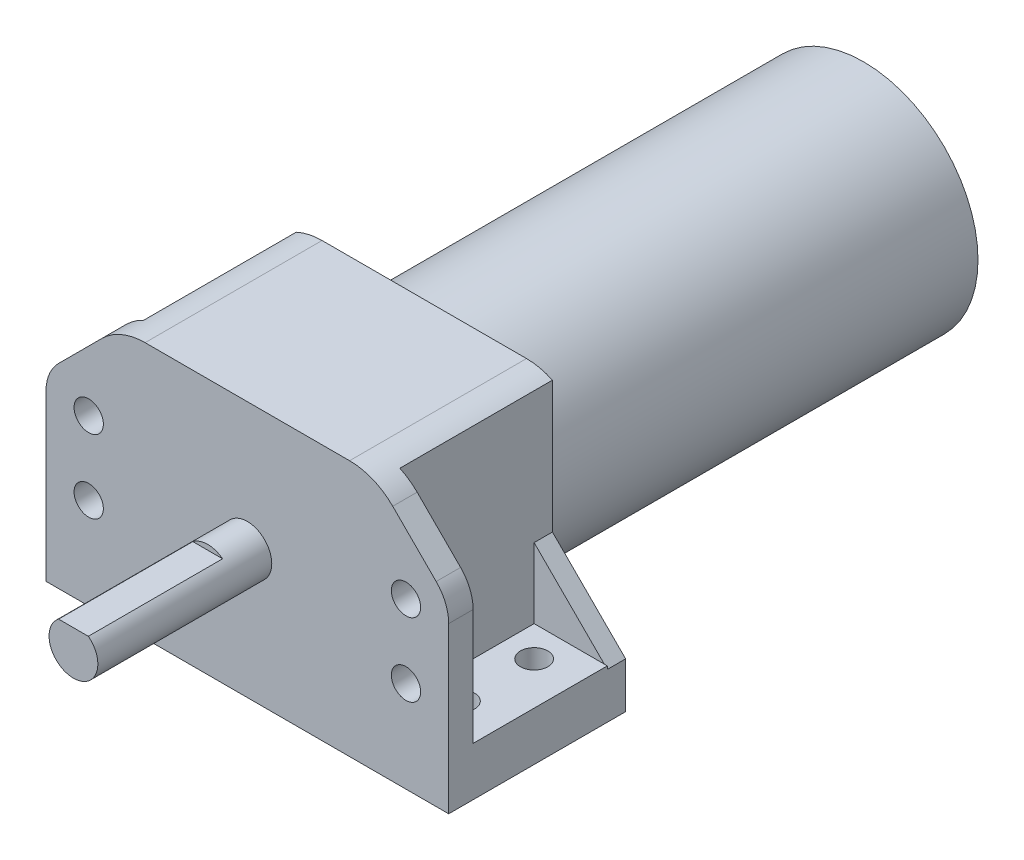
ISO-10303-21;
HEADER;
FILE_DESCRIPTION(('STEP AP214'),'2;1');
FILE_NAME('part.step','',(''),(''),'','','');
FILE_SCHEMA(('AUTOMOTIVE_DESIGN { 1 0 10303 214 1 1 1 1 }'));
ENDSEC;
DATA;
#1=APPLICATION_CONTEXT('core data for automotive mechanical design processes');
#2=APPLICATION_PROTOCOL_DEFINITION('international standard','automotive_design',2000,#1);
#3=PRODUCT_CONTEXT('',#1,'mechanical');
#4=PRODUCT('Part','Part','',(#3));
#5=PRODUCT_RELATED_PRODUCT_CATEGORY('part','',(#4));
#6=PRODUCT_DEFINITION_FORMATION('','',#4);
#7=PRODUCT_DEFINITION_CONTEXT('part definition',#1,'design');
#8=PRODUCT_DEFINITION('design','',#6,#7);
#9=PRODUCT_DEFINITION_SHAPE('','',#8);
#10=(LENGTH_UNIT() NAMED_UNIT(*) SI_UNIT(.MILLI.,.METRE.));
#11=(NAMED_UNIT(*) PLANE_ANGLE_UNIT() SI_UNIT($,.RADIAN.));
#12=(NAMED_UNIT(*) SI_UNIT($,.STERADIAN.) SOLID_ANGLE_UNIT());
#13=UNCERTAINTY_MEASURE_WITH_UNIT(LENGTH_MEASURE(1.E-05),#10,'distance_accuracy_value','');
#14=(GEOMETRIC_REPRESENTATION_CONTEXT(3) GLOBAL_UNCERTAINTY_ASSIGNED_CONTEXT((#13)) GLOBAL_UNIT_ASSIGNED_CONTEXT((#10,
#11,#12)) REPRESENTATION_CONTEXT('',''));
#15=CARTESIAN_POINT('',(0.,0.,0.));
#16=DIRECTION('',(0.,0.,1.));
#17=DIRECTION('',(1.,0.,0.));
#18=AXIS2_PLACEMENT_3D('',#15,#16,#17);
#19=CARTESIAN_POINT('',(-33.,21.,72.));
#20=DIRECTION('',(-1.,0.,0.));
#21=DIRECTION('',(0.,0.,1.));
#22=AXIS2_PLACEMENT_3D('',#19,#20,#21);
#23=PLANE('',#22);
#24=DIRECTION('',(0.,0.,-1.));
#25=VECTOR('',#24,1.);
#26=CARTESIAN_POINT('',(-33.,-13.5000000000001,91.9705627484772));
#27=LINE('',#26,#25);
#28=CARTESIAN_POINT('',(-33.,-13.5000000000001,75.));
#29=VERTEX_POINT('',#28);
#30=CARTESIAN_POINT('',(-33.,-13.5000000000001,72.));
#31=VERTEX_POINT('',#30);
#32=EDGE_CURVE('E354',#29,#31,#27,.T.);
#33=ORIENTED_EDGE('',*,*,#32,.T.);
#34=DIRECTION('',(0.,-1.,0.));
#35=VECTOR('',#34,1.);
#36=CARTESIAN_POINT('',(-33.,21.,72.));
#37=LINE('',#36,#35);
#38=CARTESIAN_POINT('',(-33.,-21.,72.));
#39=VERTEX_POINT('',#38);
#40=EDGE_CURVE('E233',#31,#39,#37,.T.);
#41=ORIENTED_EDGE('',*,*,#40,.T.);
#42=DIRECTION('',(0.,0.,1.));
#43=VECTOR('',#42,1.);
#44=CARTESIAN_POINT('',(-33.,-21.,72.));
#45=LINE('',#44,#43);
#46=CARTESIAN_POINT('',(-33.,-21.,101.));
#47=VERTEX_POINT('',#46);
#48=EDGE_CURVE('E231',#39,#47,#45,.T.);
#49=ORIENTED_EDGE('',*,*,#48,.T.);
#50=DIRECTION('',(0.,-1.,0.));
#51=VECTOR('',#50,1.);
#52=CARTESIAN_POINT('',(-33.,21.,101.));
#53=LINE('',#52,#51);
#54=CARTESIAN_POINT('',(-33.,6.,101.));
#55=VERTEX_POINT('',#54);
#56=EDGE_CURVE('E237',#55,#47,#53,.T.);
#57=ORIENTED_EDGE('',*,*,#56,.F.);
#58=DIRECTION('',(0.,0.,1.));
#59=VECTOR('',#58,1.);
#60=CARTESIAN_POINT('',(-33.,6.,0.));
#61=LINE('',#60,#59);
#62=CARTESIAN_POINT('',(-33.,6.,97.));
#63=VERTEX_POINT('',#62);
#64=EDGE_CURVE('E334',#63,#55,#61,.T.);
#65=ORIENTED_EDGE('',*,*,#64,.F.);
#66=DIRECTION('',(0.,-1.,0.));
#67=VECTOR('',#66,1.);
#68=CARTESIAN_POINT('',(-33.,21.,97.));
#69=LINE('',#68,#67);
#70=CARTESIAN_POINT('',(-33.,-13.,97.));
#71=VERTEX_POINT('',#70);
#72=EDGE_CURVE('E363',#63,#71,#69,.T.);
#73=ORIENTED_EDGE('',*,*,#72,.T.);
#74=DIRECTION('',(0.,0.,-1.));
#75=VECTOR('',#74,1.);
#76=CARTESIAN_POINT('',(-33.,-13.,97.));
#77=LINE('',#76,#75);
#78=CARTESIAN_POINT('',(-33.,-13.,75.));
#79=VERTEX_POINT('',#78);
#80=EDGE_CURVE('E467',#71,#79,#77,.T.);
#81=ORIENTED_EDGE('',*,*,#80,.T.);
#82=DIRECTION('',(0.,-1.,0.));
#83=VECTOR('',#82,1.);
#84=CARTESIAN_POINT('',(-33.,-13.5000000000001,75.));
#85=LINE('',#84,#83);
#86=EDGE_CURVE('E448',#79,#29,#85,.T.);
#87=ORIENTED_EDGE('',*,*,#86,.T.);
#88=EDGE_LOOP('',(#33,#41,#49,#57,#65,#73,#81,#87));
#89=FACE_BOUND('',#88,.T.);
#90=ADVANCED_FACE('F47',(#89),#23,.T.);
#91=CARTESIAN_POINT('',(0.,0.,72.));
#92=DIRECTION('',(0.,0.,-1.));
#93=DIRECTION('',(-1.,0.,0.));
#94=AXIS2_PLACEMENT_3D('',#91,#92,#93);
#95=PLANE('',#94);
#96=DIRECTION('',(-0.707106781186544,0.707106781186551,0.));
#97=VECTOR('',#96,1.);
#98=CARTESIAN_POINT('',(21.,-1.5,72.));
#99=LINE('',#98,#97);
#100=CARTESIAN_POINT('',(33.,-13.5000000000001,72.));
#101=VERTEX_POINT('',#100);
#102=CARTESIAN_POINT('',(21.,-1.5,72.));
#103=VERTEX_POINT('',#102);
#104=EDGE_CURVE('E205',#101,#103,#99,.T.);
#105=ORIENTED_EDGE('',*,*,#104,.F.);
#106=DIRECTION('',(0.,1.,0.));
#107=VECTOR('',#106,1.);
#108=CARTESIAN_POINT('',(33.,21.,72.));
#109=LINE('',#108,#107);
#110=CARTESIAN_POINT('',(33.,-21.,72.));
#111=VERTEX_POINT('',#110);
#112=EDGE_CURVE('E219',#111,#101,#109,.T.);
#113=ORIENTED_EDGE('',*,*,#112,.F.);
#114=DIRECTION('',(1.,0.,0.));
#115=VECTOR('',#114,1.);
#116=CARTESIAN_POINT('',(33.,-21.,72.));
#117=LINE('',#116,#115);
#118=EDGE_CURVE('E228',#39,#111,#117,.T.);
#119=ORIENTED_EDGE('',*,*,#118,.F.);
#120=ORIENTED_EDGE('',*,*,#40,.F.);
#121=DIRECTION('',(-0.707106781186544,-0.707106781186551,0.));
#122=VECTOR('',#121,1.);
#123=CARTESIAN_POINT('',(-21.,-1.5,72.));
#124=LINE('',#123,#122);
#125=CARTESIAN_POINT('',(-21.,-1.5,72.));
#126=VERTEX_POINT('',#125);
#127=EDGE_CURVE('E222',#126,#31,#124,.T.);
#128=ORIENTED_EDGE('',*,*,#127,.F.);
#129=DIRECTION('',(0.,1.,0.));
#130=VECTOR('',#129,1.);
#131=CARTESIAN_POINT('',(-21.,-1.5,72.));
#132=LINE('',#131,#130);
#133=CARTESIAN_POINT('',(-21.,20.0553851381374,72.));
#134=VERTEX_POINT('',#133);
#135=EDGE_CURVE('E469',#126,#134,#132,.T.);
#136=ORIENTED_EDGE('',*,*,#135,.T.);
#137=CARTESIAN_POINT('',(-16.7573593128807,11.,72.));
#138=DIRECTION('',(0.,0.,-1.));
#139=DIRECTION('',(-1.,0.,0.));
#140=AXIS2_PLACEMENT_3D('',#137,#138,#139);
#141=CIRCLE('',#140,10.);
#142=CARTESIAN_POINT('',(-16.7573593128807,21.,72.));
#143=VERTEX_POINT('',#142);
#144=EDGE_CURVE('E299',#134,#143,#141,.T.);
#145=ORIENTED_EDGE('',*,*,#144,.T.);
#146=DIRECTION('',(-1.,0.,0.));
#147=VECTOR('',#146,1.);
#148=CARTESIAN_POINT('',(33.,21.,72.));
#149=LINE('',#148,#147);
#150=CARTESIAN_POINT('',(16.7573593128807,21.,72.));
#151=VERTEX_POINT('',#150);
#152=EDGE_CURVE('E227',#151,#143,#149,.T.);
#153=ORIENTED_EDGE('',*,*,#152,.F.);
#154=CARTESIAN_POINT('',(16.7573593128807,11.,72.));
#155=DIRECTION('',(0.,0.,-1.));
#156=DIRECTION('',(-1.,0.,0.));
#157=AXIS2_PLACEMENT_3D('',#154,#155,#156);
#158=CIRCLE('',#157,10.);
#159=CARTESIAN_POINT('',(21.,20.0553851381374,72.));
#160=VERTEX_POINT('',#159);
#161=EDGE_CURVE('E297',#151,#160,#158,.T.);
#162=ORIENTED_EDGE('',*,*,#161,.T.);
#163=DIRECTION('',(0.,1.,0.));
#164=VECTOR('',#163,1.);
#165=CARTESIAN_POINT('',(21.,-1.5,72.));
#166=LINE('',#165,#164);
#167=EDGE_CURVE('E221',#103,#160,#166,.T.);
#168=ORIENTED_EDGE('',*,*,#167,.F.);
#169=EDGE_LOOP('',(#105,#113,#119,#120,#128,#136,#145,#153,#162,#168));
#170=FACE_BOUND('',#169,.T.);
#171=CARTESIAN_POINT('',(0.,0.,72.));
#172=DIRECTION('',(0.,0.,-1.));
#173=DIRECTION('',(-1.,0.,0.));
#174=AXIS2_PLACEMENT_3D('',#171,#172,#173);
#175=CIRCLE('',#174,18.75);
#176=CARTESIAN_POINT('',(-18.75,0.,72.));
#177=VERTEX_POINT('',#176);
#178=EDGE_CURVE('E250',#177,#177,#175,.T.);
#179=ORIENTED_EDGE('',*,*,#178,.F.);
#180=EDGE_LOOP('',(#179));
#181=FACE_BOUND('',#180,.T.);
#182=ADVANCED_FACE('F216',(#170,#181),#95,.T.);
#183=CARTESIAN_POINT('',(-26.,6.,0.));
#184=DIRECTION('',(0.,0.,1.));
#185=DIRECTION('',(1.,0.,0.));
#186=AXIS2_PLACEMENT_3D('',#183,#184,#185);
#187=CYLINDRICAL_SURFACE('',#186,2.4);
#188=CARTESIAN_POINT('',(-26.,6.,101.));
#189=DIRECTION('',(0.,0.,1.));
#190=DIRECTION('',(1.,0.,0.));
#191=AXIS2_PLACEMENT_3D('',#188,#189,#190);
#192=CIRCLE('',#191,2.4);
#193=CARTESIAN_POINT('',(-23.6,6.,101.));
#194=VERTEX_POINT('',#193);
#195=EDGE_CURVE('E240',#194,#194,#192,.T.);
#196=ORIENTED_EDGE('',*,*,#195,.T.);
#197=EDGE_LOOP('',(#196));
#198=FACE_BOUND('',#197,.T.);
#199=CARTESIAN_POINT('',(-26.,6.,97.));
#200=DIRECTION('',(0.,0.,-1.));
#201=DIRECTION('',(-1.,0.,0.));
#202=AXIS2_PLACEMENT_3D('',#199,#200,#201);
#203=CIRCLE('',#202,2.4);
#204=CARTESIAN_POINT('',(-28.4,6.,97.));
#205=VERTEX_POINT('',#204);
#206=EDGE_CURVE('E373',#205,#205,#203,.F.);
#207=ORIENTED_EDGE('',*,*,#206,.F.);
#208=EDGE_LOOP('',(#207));
#209=FACE_BOUND('',#208,.T.);
#210=ADVANCED_FACE('F535',(#198,#209),#187,.F.);
#211=CARTESIAN_POINT('',(-30.9497474683058,10.9497474683058,0.));
#212=DIRECTION('',(0.707106781186546,-0.707106781186549,0.));
#213=DIRECTION('',(0.707106781186549,0.707106781186546,0.));
#214=AXIS2_PLACEMENT_3D('',#211,#212,#213);
#215=PLANE('',#214);
#216=DIRECTION('',(0.707106781186549,0.707106781186546,0.));
#217=VECTOR('',#216,1.);
#218=CARTESIAN_POINT('',(-30.9497474683058,10.9497474683058,101.));
#219=LINE('',#218,#217);
#220=CARTESIAN_POINT('',(-30.9497474683058,10.9497474683058,101.));
#221=VERTEX_POINT('',#220);
#222=CARTESIAN_POINT('',(-23.8284271247461,18.0710678118655,101.));
#223=VERTEX_POINT('',#222);
#224=EDGE_CURVE('E336',#221,#223,#219,.T.);
#225=ORIENTED_EDGE('',*,*,#224,.T.);
#226=DIRECTION('',(0.,0.,1.));
#227=VECTOR('',#226,1.);
#228=CARTESIAN_POINT('',(-23.8284271247461,18.0710678118655,72.));
#229=LINE('',#228,#227);
#230=CARTESIAN_POINT('',(-23.8284271247461,18.0710678118655,97.));
#231=VERTEX_POINT('',#230);
#232=EDGE_CURVE('E291',#223,#231,#229,.F.);
#233=ORIENTED_EDGE('',*,*,#232,.T.);
#234=DIRECTION('',(0.707106781186549,0.707106781186546,0.));
#235=VECTOR('',#234,1.);
#236=CARTESIAN_POINT('',(-30.9497474683058,10.9497474683058,97.));
#237=LINE('',#236,#235);
#238=CARTESIAN_POINT('',(-30.9497474683058,10.9497474683058,97.));
#239=VERTEX_POINT('',#238);
#240=EDGE_CURVE('E371',#239,#231,#237,.T.);
#241=ORIENTED_EDGE('',*,*,#240,.F.);
#242=DIRECTION('',(0.,0.,1.));
#243=VECTOR('',#242,1.);
#244=CARTESIAN_POINT('',(-30.9497474683058,10.9497474683058,0.));
#245=LINE('',#244,#243);
#246=EDGE_CURVE('E337',#239,#221,#245,.T.);
#247=ORIENTED_EDGE('',*,*,#246,.T.);
#248=EDGE_LOOP('',(#225,#233,#241,#247));
#249=FACE_BOUND('',#248,.T.);
#250=ADVANCED_FACE('F513',(#249),#215,.F.);
#251=CARTESIAN_POINT('',(-26.,6.,0.));
#252=DIRECTION('',(0.,0.,1.));
#253=DIRECTION('',(1.,0.,0.));
#254=AXIS2_PLACEMENT_3D('',#251,#252,#253);
#255=CYLINDRICAL_SURFACE('',#254,6.99999999999999);
#256=CARTESIAN_POINT('',(-26.,6.,97.));
#257=DIRECTION('',(0.,0.,-1.));
#258=DIRECTION('',(-1.,0.,0.));
#259=AXIS2_PLACEMENT_3D('',#256,#257,#258);
#260=CIRCLE('',#259,6.99999999999999);
#261=EDGE_CURVE('E282',#63,#239,#260,.T.);
#262=ORIENTED_EDGE('',*,*,#261,.F.);
#263=ORIENTED_EDGE('',*,*,#64,.T.);
#264=CARTESIAN_POINT('',(-26.,6.,101.));
#265=DIRECTION('',(0.,0.,-1.));
#266=DIRECTION('',(-1.,0.,0.));
#267=AXIS2_PLACEMENT_3D('',#264,#265,#266);
#268=CIRCLE('',#267,6.99999999999999);
#269=EDGE_CURVE('E333',#55,#221,#268,.T.);
#270=ORIENTED_EDGE('',*,*,#269,.T.);
#271=ORIENTED_EDGE('',*,*,#246,.F.);
#272=EDGE_LOOP('',(#262,#263,#270,#271));
#273=FACE_BOUND('',#272,.T.);
#274=ADVANCED_FACE('F366',(#273),#255,.T.);
#275=CARTESIAN_POINT('',(-26.,-6.,0.));
#276=DIRECTION('',(0.,0.,1.));
#277=DIRECTION('',(1.,0.,0.));
#278=AXIS2_PLACEMENT_3D('',#275,#276,#277);
#279=CYLINDRICAL_SURFACE('',#278,2.4);
#280=CARTESIAN_POINT('',(-26.,-6.,101.));
#281=DIRECTION('',(0.,0.,1.));
#282=DIRECTION('',(1.,0.,0.));
#283=AXIS2_PLACEMENT_3D('',#280,#281,#282);
#284=CIRCLE('',#283,2.4);
#285=CARTESIAN_POINT('',(-23.6,-6.,101.));
#286=VERTEX_POINT('',#285);
#287=EDGE_CURVE('E330',#286,#286,#284,.T.);
#288=ORIENTED_EDGE('',*,*,#287,.T.);
#289=EDGE_LOOP('',(#288));
#290=FACE_BOUND('',#289,.T.);
#291=CARTESIAN_POINT('',(-26.,-6.,97.));
#292=DIRECTION('',(0.,0.,-1.));
#293=DIRECTION('',(-1.,0.,0.));
#294=AXIS2_PLACEMENT_3D('',#291,#292,#293);
#295=CIRCLE('',#294,2.4);
#296=CARTESIAN_POINT('',(-28.4,-6.,97.));
#297=VERTEX_POINT('',#296);
#298=EDGE_CURVE('E279',#297,#297,#295,.F.);
#299=ORIENTED_EDGE('',*,*,#298,.F.);
#300=EDGE_LOOP('',(#299));
#301=FACE_BOUND('',#300,.T.);
#302=ADVANCED_FACE('F599',(#290,#301),#279,.F.);
#303=CARTESIAN_POINT('',(-26.,21.,92.));
#304=DIRECTION('',(0.,-1.,0.));
#305=DIRECTION('',(1.,0.,0.));
#306=AXIS2_PLACEMENT_3D('',#303,#304,#305);
#307=CYLINDRICAL_SURFACE('',#306,2.25);
#308=CARTESIAN_POINT('',(-26.,-21.,92.));
#309=DIRECTION('',(0.,-1.,0.));
#310=DIRECTION('',(1.,0.,0.));
#311=AXIS2_PLACEMENT_3D('',#308,#309,#310);
#312=CIRCLE('',#311,2.25);
#313=CARTESIAN_POINT('',(-23.75,-21.,92.));
#314=VERTEX_POINT('',#313);
#315=EDGE_CURVE('E413',#314,#314,#312,.T.);
#316=ORIENTED_EDGE('',*,*,#315,.T.);
#317=EDGE_LOOP('',(#316));
#318=FACE_BOUND('',#317,.T.);
#319=CARTESIAN_POINT('',(-26.,-13.,92.));
#320=DIRECTION('',(0.,1.,0.));
#321=DIRECTION('',(0.,0.,1.));
#322=AXIS2_PLACEMENT_3D('',#319,#320,#321);
#323=CIRCLE('',#322,2.25);
#324=CARTESIAN_POINT('',(-26.,-13.,94.25));
#325=VERTEX_POINT('',#324);
#326=EDGE_CURVE('E277',#325,#325,#323,.F.);
#327=ORIENTED_EDGE('',*,*,#326,.F.);
#328=EDGE_LOOP('',(#327));
#329=FACE_BOUND('',#328,.T.);
#330=ADVANCED_FACE('F587',(#318,#329),#307,.F.);
#331=CARTESIAN_POINT('',(-26.,21.,80.));
#332=DIRECTION('',(0.,-1.,0.));
#333=DIRECTION('',(1.,0.,0.));
#334=AXIS2_PLACEMENT_3D('',#331,#332,#333);
#335=CYLINDRICAL_SURFACE('',#334,2.25);
#336=CARTESIAN_POINT('',(-26.,-21.,80.));
#337=DIRECTION('',(0.,-1.,0.));
#338=DIRECTION('',(1.,0.,0.));
#339=AXIS2_PLACEMENT_3D('',#336,#337,#338);
#340=CIRCLE('',#339,2.25);
#341=CARTESIAN_POINT('',(-23.75,-21.,80.));
#342=VERTEX_POINT('',#341);
#343=EDGE_CURVE('E410',#342,#342,#340,.T.);
#344=ORIENTED_EDGE('',*,*,#343,.T.);
#345=EDGE_LOOP('',(#344));
#346=FACE_BOUND('',#345,.T.);
#347=CARTESIAN_POINT('',(-26.,-13.,80.));
#348=DIRECTION('',(0.,1.,0.));
#349=DIRECTION('',(0.,0.,1.));
#350=AXIS2_PLACEMENT_3D('',#347,#348,#349);
#351=CIRCLE('',#350,2.25);
#352=CARTESIAN_POINT('',(-26.,-13.,82.25));
#353=VERTEX_POINT('',#352);
#354=EDGE_CURVE('E274',#353,#353,#351,.F.);
#355=ORIENTED_EDGE('',*,*,#354,.F.);
#356=EDGE_LOOP('',(#355));
#357=FACE_BOUND('',#356,.T.);
#358=ADVANCED_FACE('F547',(#346,#357),#335,.F.);
#359=CARTESIAN_POINT('',(0.,0.,101.));
#360=DIRECTION('',(0.,0.,1.));
#361=DIRECTION('',(1.,0.,0.));
#362=AXIS2_PLACEMENT_3D('',#359,#360,#361);
#363=PLANE('',#362);
#364=ORIENTED_EDGE('',*,*,#287,.F.);
#365=EDGE_LOOP('',(#364));
#366=FACE_BOUND('',#365,.T.);
#367=DIRECTION('',(-1.,0.,0.));
#368=VECTOR('',#367,1.);
#369=CARTESIAN_POINT('',(33.,21.,101.));
#370=LINE('',#369,#368);
#371=CARTESIAN_POINT('',(16.7573593128807,21.,101.));
#372=VERTEX_POINT('',#371);
#373=CARTESIAN_POINT('',(-16.7573593128807,21.,101.));
#374=VERTEX_POINT('',#373);
#375=EDGE_CURVE('E246',#372,#374,#370,.T.);
#376=ORIENTED_EDGE('',*,*,#375,.T.);
#377=CARTESIAN_POINT('',(-16.7573593128807,11.,101.));
#378=DIRECTION('',(0.,0.,1.));
#379=DIRECTION('',(1.,0.,0.));
#380=AXIS2_PLACEMENT_3D('',#377,#378,#379);
#381=CIRCLE('',#380,10.);
#382=EDGE_CURVE('E289',#374,#223,#381,.T.);
#383=ORIENTED_EDGE('',*,*,#382,.T.);
#384=ORIENTED_EDGE('',*,*,#224,.F.);
#385=ORIENTED_EDGE('',*,*,#269,.F.);
#386=ORIENTED_EDGE('',*,*,#56,.T.);
#387=DIRECTION('',(1.,0.,0.));
#388=VECTOR('',#387,1.);
#389=CARTESIAN_POINT('',(33.,-21.,101.));
#390=LINE('',#389,#388);
#391=CARTESIAN_POINT('',(33.,-21.,101.));
#392=VERTEX_POINT('',#391);
#393=EDGE_CURVE('E239',#47,#392,#390,.T.);
#394=ORIENTED_EDGE('',*,*,#393,.T.);
#395=DIRECTION('',(0.,1.,0.));
#396=VECTOR('',#395,1.);
#397=CARTESIAN_POINT('',(33.,21.,101.));
#398=LINE('',#397,#396);
#399=CARTESIAN_POINT('',(33.,5.99999999999998,101.));
#400=VERTEX_POINT('',#399);
#401=EDGE_CURVE('E243',#392,#400,#398,.T.);
#402=ORIENTED_EDGE('',*,*,#401,.T.);
#403=CARTESIAN_POINT('',(26.,5.99999999999998,101.));
#404=DIRECTION('',(0.,0.,-1.));
#405=DIRECTION('',(1.,0.,0.));
#406=AXIS2_PLACEMENT_3D('',#403,#404,#405);
#407=CIRCLE('',#406,6.99999999999999);
#408=CARTESIAN_POINT('',(30.9497474683058,10.9497474683058,101.));
#409=VERTEX_POINT('',#408);
#410=EDGE_CURVE('E320',#409,#400,#407,.T.);
#411=ORIENTED_EDGE('',*,*,#410,.F.);
#412=DIRECTION('',(0.707106781186548,-0.707106781186547,0.));
#413=VECTOR('',#412,1.);
#414=CARTESIAN_POINT('',(30.9497474683058,10.9497474683058,101.));
#415=LINE('',#414,#413);
#416=CARTESIAN_POINT('',(23.8284271247461,18.0710678118655,101.));
#417=VERTEX_POINT('',#416);
#418=EDGE_CURVE('E309',#417,#409,#415,.T.);
#419=ORIENTED_EDGE('',*,*,#418,.F.);
#420=CARTESIAN_POINT('',(16.7573593128807,11.,101.));
#421=DIRECTION('',(0.,0.,1.));
#422=DIRECTION('',(1.,0.,0.));
#423=AXIS2_PLACEMENT_3D('',#420,#421,#422);
#424=CIRCLE('',#423,10.);
#425=EDGE_CURVE('E287',#417,#372,#424,.T.);
#426=ORIENTED_EDGE('',*,*,#425,.T.);
#427=EDGE_LOOP('',(#376,#383,#384,#385,#386,#394,#402,#411,#419,#426));
#428=FACE_BOUND('',#427,.T.);
#429=CARTESIAN_POINT('',(26.,-6.00000000000002,101.));
#430=DIRECTION('',(0.,0.,1.));
#431=DIRECTION('',(-1.,0.,0.));
#432=AXIS2_PLACEMENT_3D('',#429,#430,#431);
#433=CIRCLE('',#432,2.4);
#434=CARTESIAN_POINT('',(23.6,-6.00000000000002,101.));
#435=VERTEX_POINT('',#434);
#436=EDGE_CURVE('E324',#435,#435,#433,.T.);
#437=ORIENTED_EDGE('',*,*,#436,.F.);
#438=EDGE_LOOP('',(#437));
#439=FACE_BOUND('',#438,.T.);
#440=CARTESIAN_POINT('',(26.,5.99999999999998,101.));
#441=DIRECTION('',(0.,0.,1.));
#442=DIRECTION('',(-1.,0.,0.));
#443=AXIS2_PLACEMENT_3D('',#440,#441,#442);
#444=CIRCLE('',#443,2.4);
#445=CARTESIAN_POINT('',(23.6,5.99999999999998,101.));
#446=VERTEX_POINT('',#445);
#447=EDGE_CURVE('E321',#446,#446,#444,.T.);
#448=ORIENTED_EDGE('',*,*,#447,.F.);
#449=EDGE_LOOP('',(#448));
#450=FACE_BOUND('',#449,.T.);
#451=ORIENTED_EDGE('',*,*,#195,.F.);
#452=EDGE_LOOP('',(#451));
#453=FACE_BOUND('',#452,.T.);
#454=CARTESIAN_POINT('',(0.,0.,101.));
#455=DIRECTION('',(0.,0.,1.));
#456=DIRECTION('',(1.,0.,0.));
#457=AXIS2_PLACEMENT_3D('',#454,#455,#456);
#458=CIRCLE('',#457,4.);
#459=CARTESIAN_POINT('',(4.,0.,101.));
#460=VERTEX_POINT('',#459);
#461=EDGE_CURVE('E253',#460,#460,#458,.T.);
#462=ORIENTED_EDGE('',*,*,#461,.F.);
#463=EDGE_LOOP('',(#462));
#464=FACE_BOUND('',#463,.T.);
#465=ADVANCED_FACE('F316',(#366,#428,#439,#450,#453,#464),#363,.T.);
#466=CARTESIAN_POINT('',(0.,0.,101.));
#467=DIRECTION('',(0.,0.,1.));
#468=DIRECTION('',(1.,0.,0.));
#469=AXIS2_PLACEMENT_3D('',#466,#467,#468);
#470=CYLINDRICAL_SURFACE('',#469,4.);
#471=DIRECTION('',(0.,0.,1.));
#472=VECTOR('',#471,1.);
#473=CARTESIAN_POINT('',(2.43948765112677,3.17,107.5));
#474=LINE('',#473,#472);
#475=CARTESIAN_POINT('',(2.43948765112677,3.17,107.5));
#476=VERTEX_POINT('',#475);
#477=CARTESIAN_POINT('',(2.43948765112677,3.17,129.5));
#478=VERTEX_POINT('',#477);
#479=EDGE_CURVE('E464',#476,#478,#474,.T.);
#480=ORIENTED_EDGE('',*,*,#479,.T.);
#481=CARTESIAN_POINT('',(0.,0.,129.5));
#482=DIRECTION('',(0.,0.,1.));
#483=DIRECTION('',(1.,0.,0.));
#484=AXIS2_PLACEMENT_3D('',#481,#482,#483);
#485=CIRCLE('',#484,4.);
#486=CARTESIAN_POINT('',(-2.43948765112677,3.17,129.5));
#487=VERTEX_POINT('',#486);
#488=EDGE_CURVE('E257',#487,#478,#485,.T.);
#489=ORIENTED_EDGE('',*,*,#488,.F.);
#490=DIRECTION('',(0.,0.,1.));
#491=VECTOR('',#490,1.);
#492=CARTESIAN_POINT('',(-2.43948765112677,3.17,107.5));
#493=LINE('',#492,#491);
#494=CARTESIAN_POINT('',(-2.43948765112677,3.17,107.5));
#495=VERTEX_POINT('',#494);
#496=EDGE_CURVE('E62',#495,#487,#493,.T.);
#497=ORIENTED_EDGE('',*,*,#496,.F.);
#498=CARTESIAN_POINT('',(0.,0.,107.5));
#499=DIRECTION('',(0.,0.,1.));
#500=DIRECTION('',(1.,0.,0.));
#501=AXIS2_PLACEMENT_3D('',#498,#499,#500);
#502=CIRCLE('',#501,4.);
#503=EDGE_CURVE('E458',#476,#495,#502,.T.);
#504=ORIENTED_EDGE('',*,*,#503,.F.);
#505=EDGE_LOOP('',(#480,#489,#497,#504));
#506=FACE_BOUND('',#505,.T.);
#507=ORIENTED_EDGE('',*,*,#461,.T.);
#508=EDGE_LOOP('',(#507));
#509=FACE_BOUND('',#508,.T.);
#510=ADVANCED_FACE('F540',(#506,#509),#470,.T.);
#511=CARTESIAN_POINT('',(0.,0.,129.5));
#512=DIRECTION('',(0.,0.,1.));
#513=DIRECTION('',(1.,0.,0.));
#514=AXIS2_PLACEMENT_3D('',#511,#512,#513);
#515=PLANE('',#514);
#516=DIRECTION('',(1.,0.,0.));
#517=VECTOR('',#516,1.);
#518=CARTESIAN_POINT('',(-2.43948765112677,3.17,129.5));
#519=LINE('',#518,#517);
#520=EDGE_CURVE('E457',#487,#478,#519,.T.);
#521=ORIENTED_EDGE('',*,*,#520,.F.);
#522=ORIENTED_EDGE('',*,*,#488,.T.);
#523=EDGE_LOOP('',(#521,#522));
#524=FACE_BOUND('',#523,.T.);
#525=ADVANCED_FACE('F543',(#524),#515,.T.);
#526=CARTESIAN_POINT('',(33.,21.,72.));
#527=DIRECTION('',(0.,1.,0.));
#528=DIRECTION('',(-1.,0.,0.));
#529=AXIS2_PLACEMENT_3D('',#526,#527,#528);
#530=PLANE('',#529);
#531=ORIENTED_EDGE('',*,*,#152,.T.);
#532=DIRECTION('',(0.,0.,1.));
#533=VECTOR('',#532,1.);
#534=CARTESIAN_POINT('',(-16.7573593128807,21.,101.));
#535=LINE('',#534,#533);
#536=EDGE_CURVE('E284',#143,#374,#535,.T.);
#537=ORIENTED_EDGE('',*,*,#536,.T.);
#538=ORIENTED_EDGE('',*,*,#375,.F.);
#539=DIRECTION('',(0.,0.,1.));
#540=VECTOR('',#539,1.);
#541=CARTESIAN_POINT('',(16.7573593128807,21.,72.));
#542=LINE('',#541,#540);
#543=EDGE_CURVE('E262',#372,#151,#542,.F.);
#544=ORIENTED_EDGE('',*,*,#543,.T.);
#545=EDGE_LOOP('',(#531,#537,#538,#544));
#546=FACE_BOUND('',#545,.T.);
#547=ADVANCED_FACE('F511',(#546),#530,.T.);
#548=CARTESIAN_POINT('',(33.,21.,72.));
#549=DIRECTION('',(1.,0.,0.));
#550=DIRECTION('',(0.,0.,-1.));
#551=AXIS2_PLACEMENT_3D('',#548,#549,#550);
#552=PLANE('',#551);
#553=DIRECTION('',(0.,0.,-1.));
#554=VECTOR('',#553,1.);
#555=CARTESIAN_POINT('',(33.,-13.5000000000001,91.9705627484772));
#556=LINE('',#555,#554);
#557=CARTESIAN_POINT('',(33.,-13.5000000000001,75.));
#558=VERTEX_POINT('',#557);
#559=EDGE_CURVE('E201',#558,#101,#556,.T.);
#560=ORIENTED_EDGE('',*,*,#559,.F.);
#561=DIRECTION('',(0.,1.,0.));
#562=VECTOR('',#561,1.);
#563=CARTESIAN_POINT('',(33.,-13.5000000000001,75.));
#564=LINE('',#563,#562);
#565=CARTESIAN_POINT('',(33.,-13.,75.));
#566=VERTEX_POINT('',#565);
#567=EDGE_CURVE('E440',#558,#566,#564,.T.);
#568=ORIENTED_EDGE('',*,*,#567,.T.);
#569=DIRECTION('',(0.,0.,-1.));
#570=VECTOR('',#569,1.);
#571=CARTESIAN_POINT('',(33.,-13.,97.));
#572=LINE('',#571,#570);
#573=CARTESIAN_POINT('',(33.,-13.,97.));
#574=VERTEX_POINT('',#573);
#575=EDGE_CURVE('E384',#574,#566,#572,.T.);
#576=ORIENTED_EDGE('',*,*,#575,.F.);
#577=DIRECTION('',(0.,-1.,0.));
#578=VECTOR('',#577,1.);
#579=CARTESIAN_POINT('',(33.,21.,97.));
#580=LINE('',#579,#578);
#581=CARTESIAN_POINT('',(33.,5.99999999999998,97.));
#582=VERTEX_POINT('',#581);
#583=EDGE_CURVE('E380',#582,#574,#580,.T.);
#584=ORIENTED_EDGE('',*,*,#583,.F.);
#585=DIRECTION('',(0.,0.,1.));
#586=VECTOR('',#585,1.);
#587=CARTESIAN_POINT('',(33.,5.99999999999998,0.));
#588=LINE('',#587,#586);
#589=EDGE_CURVE('E421',#582,#400,#588,.T.);
#590=ORIENTED_EDGE('',*,*,#589,.T.);
#591=ORIENTED_EDGE('',*,*,#401,.F.);
#592=DIRECTION('',(0.,0.,1.));
#593=VECTOR('',#592,1.);
#594=CARTESIAN_POINT('',(33.,-21.,72.));
#595=LINE('',#594,#593);
#596=EDGE_CURVE('E226',#111,#392,#595,.T.);
#597=ORIENTED_EDGE('',*,*,#596,.F.);
#598=ORIENTED_EDGE('',*,*,#112,.T.);
#599=EDGE_LOOP('',(#560,#568,#576,#584,#590,#591,#597,#598));
#600=FACE_BOUND('',#599,.T.);
#601=ADVANCED_FACE('F224',(#600),#552,.T.);
#602=CARTESIAN_POINT('',(33.,-21.,72.));
#603=DIRECTION('',(0.,-1.,0.));
#604=DIRECTION('',(1.,0.,0.));
#605=AXIS2_PLACEMENT_3D('',#602,#603,#604);
#606=PLANE('',#605);
#607=CARTESIAN_POINT('',(26.,-21.,92.));
#608=DIRECTION('',(0.,-1.,0.));
#609=DIRECTION('',(-1.,0.,0.));
#610=AXIS2_PLACEMENT_3D('',#607,#608,#609);
#611=CIRCLE('',#610,2.25);
#612=CARTESIAN_POINT('',(23.75,-21.,92.));
#613=VERTEX_POINT('',#612);
#614=EDGE_CURVE('E409',#613,#613,#611,.T.);
#615=ORIENTED_EDGE('',*,*,#614,.F.);
#616=EDGE_LOOP('',(#615));
#617=FACE_BOUND('',#616,.T.);
#618=CARTESIAN_POINT('',(26.,-21.,80.));
#619=DIRECTION('',(0.,-1.,0.));
#620=DIRECTION('',(-1.,0.,0.));
#621=AXIS2_PLACEMENT_3D('',#618,#619,#620);
#622=CIRCLE('',#621,2.25);
#623=CARTESIAN_POINT('',(23.75,-21.,80.));
#624=VERTEX_POINT('',#623);
#625=EDGE_CURVE('E414',#624,#624,#622,.T.);
#626=ORIENTED_EDGE('',*,*,#625,.F.);
#627=EDGE_LOOP('',(#626));
#628=FACE_BOUND('',#627,.T.);
#629=ORIENTED_EDGE('',*,*,#343,.F.);
#630=EDGE_LOOP('',(#629));
#631=FACE_BOUND('',#630,.T.);
#632=ORIENTED_EDGE('',*,*,#315,.F.);
#633=EDGE_LOOP('',(#632));
#634=FACE_BOUND('',#633,.T.);
#635=ORIENTED_EDGE('',*,*,#393,.F.);
#636=ORIENTED_EDGE('',*,*,#48,.F.);
#637=ORIENTED_EDGE('',*,*,#118,.T.);
#638=ORIENTED_EDGE('',*,*,#596,.T.);
#639=EDGE_LOOP('',(#635,#636,#637,#638));
#640=FACE_BOUND('',#639,.T.);
#641=ADVANCED_FACE('F357',(#617,#628,#631,#634,#640),#606,.T.);
#642=CARTESIAN_POINT('',(0.,0.,0.));
#643=DIRECTION('',(0.,0.,1.));
#644=DIRECTION('',(1.,0.,0.));
#645=AXIS2_PLACEMENT_3D('',#642,#643,#644);
#646=PLANE('',#645);
#647=CARTESIAN_POINT('',(0.,0.,0.));
#648=DIRECTION('',(0.,0.,1.));
#649=DIRECTION('',(1.,0.,0.));
#650=AXIS2_PLACEMENT_3D('',#647,#648,#649);
#651=CIRCLE('',#650,18.75);
#652=CARTESIAN_POINT('',(18.75,0.,0.));
#653=VERTEX_POINT('',#652);
#654=EDGE_CURVE('E256',#653,#653,#651,.T.);
#655=ORIENTED_EDGE('',*,*,#654,.F.);
#656=EDGE_LOOP('',(#655));
#657=FACE_BOUND('',#656,.T.);
#658=ADVANCED_FACE('F552',(#657),#646,.F.);
#659=CARTESIAN_POINT('',(0.,0.,129.5));
#660=DIRECTION('',(0.,0.,-1.));
#661=DIRECTION('',(-1.,0.,0.));
#662=AXIS2_PLACEMENT_3D('',#659,#660,#661);
#663=CYLINDRICAL_SURFACE('',#662,18.75);
#664=ORIENTED_EDGE('',*,*,#178,.T.);
#665=EDGE_LOOP('',(#664));
#666=FACE_BOUND('',#665,.T.);
#667=ORIENTED_EDGE('',*,*,#654,.T.);
#668=EDGE_LOOP('',(#667));
#669=FACE_BOUND('',#668,.T.);
#670=ADVANCED_FACE('F555',(#666,#669),#663,.T.);
#671=CARTESIAN_POINT('',(26.,5.99999999999998,0.));
#672=DIRECTION('',(0.,0.,1.));
#673=DIRECTION('',(1.,0.,0.));
#674=AXIS2_PLACEMENT_3D('',#671,#672,#673);
#675=CYLINDRICAL_SURFACE('',#674,6.99999999999999);
#676=ORIENTED_EDGE('',*,*,#589,.F.);
#677=CARTESIAN_POINT('',(26.,5.99999999999998,97.));
#678=DIRECTION('',(0.,0.,1.));
#679=DIRECTION('',(1.,0.,0.));
#680=AXIS2_PLACEMENT_3D('',#677,#678,#679);
#681=CIRCLE('',#680,6.99999999999999);
#682=CARTESIAN_POINT('',(30.9497474683058,10.9497474683058,97.));
#683=VERTEX_POINT('',#682);
#684=EDGE_CURVE('E406',#582,#683,#681,.T.);
#685=ORIENTED_EDGE('',*,*,#684,.T.);
#686=DIRECTION('',(0.,0.,1.));
#687=VECTOR('',#686,1.);
#688=CARTESIAN_POINT('',(30.9497474683058,10.9497474683058,0.));
#689=LINE('',#688,#687);
#690=EDGE_CURVE('E326',#683,#409,#689,.T.);
#691=ORIENTED_EDGE('',*,*,#690,.T.);
#692=ORIENTED_EDGE('',*,*,#410,.T.);
#693=EDGE_LOOP('',(#676,#685,#691,#692));
#694=FACE_BOUND('',#693,.T.);
#695=ADVANCED_FACE('F426',(#694),#675,.T.);
#696=CARTESIAN_POINT('',(30.9497474683058,10.9497474683058,0.));
#697=DIRECTION('',(-0.707106781186547,-0.707106781186548,0.));
#698=DIRECTION('',(0.707106781186548,-0.707106781186547,0.));
#699=AXIS2_PLACEMENT_3D('',#696,#697,#698);
#700=PLANE('',#699);
#701=DIRECTION('',(-0.707106781186548,0.707106781186547,0.));
#702=VECTOR('',#701,1.);
#703=CARTESIAN_POINT('',(30.9497474683058,10.9497474683058,97.));
#704=LINE('',#703,#702);
#705=CARTESIAN_POINT('',(23.8284271247461,18.0710678118655,97.));
#706=VERTEX_POINT('',#705);
#707=EDGE_CURVE('E311',#683,#706,#704,.T.);
#708=ORIENTED_EDGE('',*,*,#707,.T.);
#709=DIRECTION('',(0.,0.,1.));
#710=VECTOR('',#709,1.);
#711=CARTESIAN_POINT('',(23.8284271247461,18.0710678118655,101.));
#712=LINE('',#711,#710);
#713=EDGE_CURVE('E301',#706,#417,#712,.T.);
#714=ORIENTED_EDGE('',*,*,#713,.T.);
#715=ORIENTED_EDGE('',*,*,#418,.T.);
#716=ORIENTED_EDGE('',*,*,#690,.F.);
#717=EDGE_LOOP('',(#708,#714,#715,#716));
#718=FACE_BOUND('',#717,.T.);
#719=ADVANCED_FACE('F307',(#718),#700,.F.);
#720=CARTESIAN_POINT('',(26.,5.99999999999998,0.));
#721=DIRECTION('',(0.,0.,1.));
#722=DIRECTION('',(1.,0.,0.));
#723=AXIS2_PLACEMENT_3D('',#720,#721,#722);
#724=CYLINDRICAL_SURFACE('',#723,2.4);
#725=CARTESIAN_POINT('',(26.,5.99999999999998,97.));
#726=DIRECTION('',(0.,0.,1.));
#727=DIRECTION('',(1.,0.,0.));
#728=AXIS2_PLACEMENT_3D('',#725,#726,#727);
#729=CIRCLE('',#728,2.4);
#730=CARTESIAN_POINT('',(28.4,5.99999999999998,97.));
#731=VERTEX_POINT('',#730);
#732=EDGE_CURVE('E273',#731,#731,#729,.F.);
#733=ORIENTED_EDGE('',*,*,#732,.T.);
#734=EDGE_LOOP('',(#733));
#735=FACE_BOUND('',#734,.T.);
#736=ORIENTED_EDGE('',*,*,#447,.T.);
#737=EDGE_LOOP('',(#736));
#738=FACE_BOUND('',#737,.T.);
#739=ADVANCED_FACE('F603',(#735,#738),#724,.F.);
#740=CARTESIAN_POINT('',(26.,-6.00000000000002,0.));
#741=DIRECTION('',(0.,0.,1.));
#742=DIRECTION('',(1.,0.,0.));
#743=AXIS2_PLACEMENT_3D('',#740,#741,#742);
#744=CYLINDRICAL_SURFACE('',#743,2.4);
#745=CARTESIAN_POINT('',(26.,-6.00000000000002,97.));
#746=DIRECTION('',(0.,0.,1.));
#747=DIRECTION('',(1.,0.,0.));
#748=AXIS2_PLACEMENT_3D('',#745,#746,#747);
#749=CIRCLE('',#748,2.4);
#750=CARTESIAN_POINT('',(28.4,-6.00000000000002,97.));
#751=VERTEX_POINT('',#750);
#752=EDGE_CURVE('E270',#751,#751,#749,.F.);
#753=ORIENTED_EDGE('',*,*,#752,.T.);
#754=EDGE_LOOP('',(#753));
#755=FACE_BOUND('',#754,.T.);
#756=ORIENTED_EDGE('',*,*,#436,.T.);
#757=EDGE_LOOP('',(#756));
#758=FACE_BOUND('',#757,.T.);
#759=ADVANCED_FACE('F592',(#755,#758),#744,.F.);
#760=CARTESIAN_POINT('',(26.,21.,80.));
#761=DIRECTION('',(0.,-1.,0.));
#762=DIRECTION('',(1.,0.,0.));
#763=AXIS2_PLACEMENT_3D('',#760,#761,#762);
#764=CYLINDRICAL_SURFACE('',#763,2.25);
#765=CARTESIAN_POINT('',(26.,-13.,80.));
#766=DIRECTION('',(0.,-1.,0.));
#767=DIRECTION('',(0.,0.,-1.));
#768=AXIS2_PLACEMENT_3D('',#765,#766,#767);
#769=CIRCLE('',#768,2.25);
#770=CARTESIAN_POINT('',(26.,-13.,77.75));
#771=VERTEX_POINT('',#770);
#772=EDGE_CURVE('E268',#771,#771,#769,.F.);
#773=ORIENTED_EDGE('',*,*,#772,.T.);
#774=EDGE_LOOP('',(#773));
#775=FACE_BOUND('',#774,.T.);
#776=ORIENTED_EDGE('',*,*,#625,.T.);
#777=EDGE_LOOP('',(#776));
#778=FACE_BOUND('',#777,.T.);
#779=ADVANCED_FACE('F589',(#775,#778),#764,.F.);
#780=CARTESIAN_POINT('',(26.,21.,92.));
#781=DIRECTION('',(0.,-1.,0.));
#782=DIRECTION('',(1.,0.,0.));
#783=AXIS2_PLACEMENT_3D('',#780,#781,#782);
#784=CYLINDRICAL_SURFACE('',#783,2.25);
#785=CARTESIAN_POINT('',(26.,-13.,92.));
#786=DIRECTION('',(0.,-1.,0.));
#787=DIRECTION('',(0.,0.,-1.));
#788=AXIS2_PLACEMENT_3D('',#785,#786,#787);
#789=CIRCLE('',#788,2.25);
#790=CARTESIAN_POINT('',(26.,-13.,89.75));
#791=VERTEX_POINT('',#790);
#792=EDGE_CURVE('E265',#791,#791,#789,.F.);
#793=ORIENTED_EDGE('',*,*,#792,.T.);
#794=EDGE_LOOP('',(#793));
#795=FACE_BOUND('',#794,.T.);
#796=ORIENTED_EDGE('',*,*,#614,.T.);
#797=EDGE_LOOP('',(#796));
#798=FACE_BOUND('',#797,.T.);
#799=ADVANCED_FACE('F575',(#795,#798),#784,.F.);
#800=CARTESIAN_POINT('',(21.,0.,0.));
#801=DIRECTION('',(1.,0.,0.));
#802=DIRECTION('',(0.,0.,-1.));
#803=AXIS2_PLACEMENT_3D('',#800,#801,#802);
#804=PLANE('',#803);
#805=ORIENTED_EDGE('',*,*,#167,.T.);
#806=DIRECTION('',(0.,0.,-1.));
#807=VECTOR('',#806,1.);
#808=CARTESIAN_POINT('',(21.,20.0553851381374,72.));
#809=LINE('',#808,#807);
#810=CARTESIAN_POINT('',(21.,20.0553851381374,97.));
#811=VERTEX_POINT('',#810);
#812=EDGE_CURVE('E55',#160,#811,#809,.F.);
#813=ORIENTED_EDGE('',*,*,#812,.T.);
#814=DIRECTION('',(0.,-1.,0.));
#815=VECTOR('',#814,1.);
#816=CARTESIAN_POINT('',(21.,21.,97.));
#817=LINE('',#816,#815);
#818=CARTESIAN_POINT('',(21.,-13.,97.));
#819=VERTEX_POINT('',#818);
#820=EDGE_CURVE('E381',#811,#819,#817,.T.);
#821=ORIENTED_EDGE('',*,*,#820,.T.);
#822=DIRECTION('',(0.,0.,-1.));
#823=VECTOR('',#822,1.);
#824=CARTESIAN_POINT('',(21.,-13.,97.));
#825=LINE('',#824,#823);
#826=CARTESIAN_POINT('',(21.,-13.,75.));
#827=VERTEX_POINT('',#826);
#828=EDGE_CURVE('E383',#819,#827,#825,.T.);
#829=ORIENTED_EDGE('',*,*,#828,.T.);
#830=DIRECTION('',(0.,1.,0.));
#831=VECTOR('',#830,1.);
#832=CARTESIAN_POINT('',(21.,-13.,75.));
#833=LINE('',#832,#831);
#834=CARTESIAN_POINT('',(21.,-1.5,75.));
#835=VERTEX_POINT('',#834);
#836=EDGE_CURVE('E387',#827,#835,#833,.T.);
#837=ORIENTED_EDGE('',*,*,#836,.T.);
#838=DIRECTION('',(0.,0.,-1.));
#839=VECTOR('',#838,1.);
#840=CARTESIAN_POINT('',(21.,-1.5,75.));
#841=LINE('',#840,#839);
#842=EDGE_CURVE('E390',#835,#103,#841,.T.);
#843=ORIENTED_EDGE('',*,*,#842,.T.);
#844=EDGE_LOOP('',(#805,#813,#821,#829,#837,#843));
#845=FACE_BOUND('',#844,.T.);
#846=ADVANCED_FACE('F433',(#845),#804,.T.);
#847=CARTESIAN_POINT('',(21.,-13.,75.));
#848=DIRECTION('',(0.,0.,-1.));
#849=DIRECTION('',(-1.,0.,0.));
#850=AXIS2_PLACEMENT_3D('',#847,#848,#849);
#851=PLANE('',#850);
#852=DIRECTION('',(1.,0.,0.));
#853=VECTOR('',#852,1.);
#854=CARTESIAN_POINT('',(21.,-13.,75.));
#855=LINE('',#854,#853);
#856=CARTESIAN_POINT('',(32.4999999999999,-13.,75.));
#857=VERTEX_POINT('',#856);
#858=EDGE_CURVE('E269',#827,#857,#855,.T.);
#859=ORIENTED_EDGE('',*,*,#858,.T.);
#860=DIRECTION('',(0.707106781186544,-0.707106781186551,0.));
#861=VECTOR('',#860,1.);
#862=CARTESIAN_POINT('',(21.,-1.5,75.));
#863=LINE('',#862,#861);
#864=EDGE_CURVE('E436',#835,#857,#863,.T.);
#865=ORIENTED_EDGE('',*,*,#864,.F.);
#866=ORIENTED_EDGE('',*,*,#836,.F.);
#867=EDGE_LOOP('',(#859,#865,#866));
#868=FACE_BOUND('',#867,.T.);
#869=ADVANCED_FACE('F439',(#868),#851,.F.);
#870=CARTESIAN_POINT('',(21.,21.,97.));
#871=DIRECTION('',(0.,0.,1.));
#872=DIRECTION('',(1.,0.,0.));
#873=AXIS2_PLACEMENT_3D('',#870,#871,#872);
#874=PLANE('',#873);
#875=ORIENTED_EDGE('',*,*,#752,.F.);
#876=EDGE_LOOP('',(#875));
#877=FACE_BOUND('',#876,.T.);
#878=ORIENTED_EDGE('',*,*,#732,.F.);
#879=EDGE_LOOP('',(#878));
#880=FACE_BOUND('',#879,.T.);
#881=ORIENTED_EDGE('',*,*,#820,.F.);
#882=CARTESIAN_POINT('',(16.7573593128807,11.,97.));
#883=DIRECTION('',(0.,0.,1.));
#884=DIRECTION('',(1.,0.,0.));
#885=AXIS2_PLACEMENT_3D('',#882,#883,#884);
#886=CIRCLE('',#885,10.);
#887=EDGE_CURVE('E11',#811,#706,#886,.F.);
#888=ORIENTED_EDGE('',*,*,#887,.T.);
#889=ORIENTED_EDGE('',*,*,#707,.F.);
#890=ORIENTED_EDGE('',*,*,#684,.F.);
#891=ORIENTED_EDGE('',*,*,#583,.T.);
#892=DIRECTION('',(1.,0.,0.));
#893=VECTOR('',#892,1.);
#894=CARTESIAN_POINT('',(21.,-13.,97.));
#895=LINE('',#894,#893);
#896=EDGE_CURVE('E393',#819,#574,#895,.T.);
#897=ORIENTED_EDGE('',*,*,#896,.F.);
#898=EDGE_LOOP('',(#881,#888,#889,#890,#891,#897));
#899=FACE_BOUND('',#898,.T.);
#900=ADVANCED_FACE('F428',(#877,#880,#899),#874,.F.);
#901=CARTESIAN_POINT('',(21.,-13.,97.));
#902=DIRECTION('',(0.,-1.,0.));
#903=DIRECTION('',(0.,0.,-1.));
#904=AXIS2_PLACEMENT_3D('',#901,#902,#903);
#905=PLANE('',#904);
#906=ORIENTED_EDGE('',*,*,#792,.F.);
#907=EDGE_LOOP('',(#906));
#908=FACE_BOUND('',#907,.T.);
#909=ORIENTED_EDGE('',*,*,#575,.T.);
#910=DIRECTION('',(1.,0.,0.));
#911=VECTOR('',#910,1.);
#912=CARTESIAN_POINT('',(21.,-13.,75.));
#913=LINE('',#912,#911);
#914=EDGE_CURVE('E455',#857,#566,#913,.T.);
#915=ORIENTED_EDGE('',*,*,#914,.F.);
#916=ORIENTED_EDGE('',*,*,#858,.F.);
#917=ORIENTED_EDGE('',*,*,#828,.F.);
#918=ORIENTED_EDGE('',*,*,#896,.T.);
#919=EDGE_LOOP('',(#909,#915,#916,#917,#918));
#920=FACE_BOUND('',#919,.T.);
#921=ORIENTED_EDGE('',*,*,#772,.F.);
#922=EDGE_LOOP('',(#921));
#923=FACE_BOUND('',#922,.T.);
#924=ADVANCED_FACE('F578',(#908,#920,#923),#905,.F.);
#925=CARTESIAN_POINT('',(-21.,0.,0.));
#926=DIRECTION('',(-1.,0.,0.));
#927=DIRECTION('',(0.,0.,-1.));
#928=AXIS2_PLACEMENT_3D('',#925,#926,#927);
#929=PLANE('',#928);
#930=DIRECTION('',(0.,-1.,0.));
#931=VECTOR('',#930,1.);
#932=CARTESIAN_POINT('',(-21.,21.,97.));
#933=LINE('',#932,#931);
#934=CARTESIAN_POINT('',(-21.,20.0553851381374,97.));
#935=VERTEX_POINT('',#934);
#936=CARTESIAN_POINT('',(-21.,-13.,97.));
#937=VERTEX_POINT('',#936);
#938=EDGE_CURVE('E479',#935,#937,#933,.T.);
#939=ORIENTED_EDGE('',*,*,#938,.F.);
#940=DIRECTION('',(0.,0.,-1.));
#941=VECTOR('',#940,1.);
#942=CARTESIAN_POINT('',(-21.,20.0553851381374,97.));
#943=LINE('',#942,#941);
#944=EDGE_CURVE('E295',#935,#134,#943,.T.);
#945=ORIENTED_EDGE('',*,*,#944,.T.);
#946=ORIENTED_EDGE('',*,*,#135,.F.);
#947=DIRECTION('',(0.,0.,-1.));
#948=VECTOR('',#947,1.);
#949=CARTESIAN_POINT('',(-21.,-1.5,75.));
#950=LINE('',#949,#948);
#951=CARTESIAN_POINT('',(-21.,-1.5,75.));
#952=VERTEX_POINT('',#951);
#953=EDGE_CURVE('E472',#952,#126,#950,.T.);
#954=ORIENTED_EDGE('',*,*,#953,.F.);
#955=DIRECTION('',(0.,1.,0.));
#956=VECTOR('',#955,1.);
#957=CARTESIAN_POINT('',(-21.,-13.,75.));
#958=LINE('',#957,#956);
#959=CARTESIAN_POINT('',(-21.,-13.,75.));
#960=VERTEX_POINT('',#959);
#961=EDGE_CURVE('E474',#960,#952,#958,.T.);
#962=ORIENTED_EDGE('',*,*,#961,.F.);
#963=DIRECTION('',(0.,0.,-1.));
#964=VECTOR('',#963,1.);
#965=CARTESIAN_POINT('',(-21.,-13.,97.));
#966=LINE('',#965,#964);
#967=EDGE_CURVE('E477',#937,#960,#966,.T.);
#968=ORIENTED_EDGE('',*,*,#967,.F.);
#969=EDGE_LOOP('',(#939,#945,#946,#954,#962,#968));
#970=FACE_BOUND('',#969,.T.);
#971=ADVANCED_FACE('F499',(#970),#929,.T.);
#972=CARTESIAN_POINT('',(-21.,21.,97.));
#973=DIRECTION('',(0.,0.,-1.));
#974=DIRECTION('',(-1.,0.,0.));
#975=AXIS2_PLACEMENT_3D('',#972,#973,#974);
#976=PLANE('',#975);
#977=ORIENTED_EDGE('',*,*,#298,.T.);
#978=EDGE_LOOP('',(#977));
#979=FACE_BOUND('',#978,.T.);
#980=ORIENTED_EDGE('',*,*,#240,.T.);
#981=CARTESIAN_POINT('',(-16.7573593128807,11.,97.));
#982=DIRECTION('',(0.,0.,-1.));
#983=DIRECTION('',(-1.,0.,0.));
#984=AXIS2_PLACEMENT_3D('',#981,#982,#983);
#985=CIRCLE('',#984,10.);
#986=EDGE_CURVE('E293',#231,#935,#985,.T.);
#987=ORIENTED_EDGE('',*,*,#986,.T.);
#988=ORIENTED_EDGE('',*,*,#938,.T.);
#989=DIRECTION('',(-1.,0.,0.));
#990=VECTOR('',#989,1.);
#991=CARTESIAN_POINT('',(-21.,-13.,97.));
#992=LINE('',#991,#990);
#993=EDGE_CURVE('E278',#937,#71,#992,.T.);
#994=ORIENTED_EDGE('',*,*,#993,.T.);
#995=ORIENTED_EDGE('',*,*,#72,.F.);
#996=ORIENTED_EDGE('',*,*,#261,.T.);
#997=EDGE_LOOP('',(#980,#987,#988,#994,#995,#996));
#998=FACE_BOUND('',#997,.T.);
#999=ORIENTED_EDGE('',*,*,#206,.T.);
#1000=EDGE_LOOP('',(#999));
#1001=FACE_BOUND('',#1000,.T.);
#1002=ADVANCED_FACE('F514',(#979,#998,#1001),#976,.T.);
#1003=CARTESIAN_POINT('',(-21.,-13.,75.));
#1004=DIRECTION('',(0.,0.,1.));
#1005=DIRECTION('',(1.,0.,0.));
#1006=AXIS2_PLACEMENT_3D('',#1003,#1004,#1005);
#1007=PLANE('',#1006);
#1008=DIRECTION('',(0.707106781186544,0.707106781186551,0.));
#1009=VECTOR('',#1008,1.);
#1010=CARTESIAN_POINT('',(-21.,-1.5,75.));
#1011=LINE('',#1010,#1009);
#1012=CARTESIAN_POINT('',(-32.4999999999999,-13.,75.));
#1013=VERTEX_POINT('',#1012);
#1014=EDGE_CURVE('E450',#1013,#952,#1011,.T.);
#1015=ORIENTED_EDGE('',*,*,#1014,.F.);
#1016=DIRECTION('',(-1.,0.,0.));
#1017=VECTOR('',#1016,1.);
#1018=CARTESIAN_POINT('',(-21.,-13.,75.));
#1019=LINE('',#1018,#1017);
#1020=EDGE_CURVE('E481',#960,#1013,#1019,.T.);
#1021=ORIENTED_EDGE('',*,*,#1020,.F.);
#1022=ORIENTED_EDGE('',*,*,#961,.T.);
#1023=EDGE_LOOP('',(#1015,#1021,#1022));
#1024=FACE_BOUND('',#1023,.T.);
#1025=ADVANCED_FACE('F495',(#1024),#1007,.T.);
#1026=CARTESIAN_POINT('',(-21.,-13.,97.));
#1027=DIRECTION('',(0.,1.,0.));
#1028=DIRECTION('',(0.,0.,1.));
#1029=AXIS2_PLACEMENT_3D('',#1026,#1027,#1028);
#1030=PLANE('',#1029);
#1031=ORIENTED_EDGE('',*,*,#80,.F.);
#1032=ORIENTED_EDGE('',*,*,#993,.F.);
#1033=ORIENTED_EDGE('',*,*,#967,.T.);
#1034=ORIENTED_EDGE('',*,*,#1020,.T.);
#1035=DIRECTION('',(-1.,0.,0.));
#1036=VECTOR('',#1035,1.);
#1037=CARTESIAN_POINT('',(-21.,-13.,75.));
#1038=LINE('',#1037,#1036);
#1039=EDGE_CURVE('E442',#1013,#79,#1038,.T.);
#1040=ORIENTED_EDGE('',*,*,#1039,.T.);
#1041=EDGE_LOOP('',(#1031,#1032,#1033,#1034,#1040));
#1042=FACE_BOUND('',#1041,.T.);
#1043=ORIENTED_EDGE('',*,*,#354,.T.);
#1044=EDGE_LOOP('',(#1043));
#1045=FACE_BOUND('',#1044,.T.);
#1046=ORIENTED_EDGE('',*,*,#326,.T.);
#1047=EDGE_LOOP('',(#1046));
#1048=FACE_BOUND('',#1047,.T.);
#1049=ADVANCED_FACE('F488',(#1042,#1045,#1048),#1030,.T.);
#1050=CARTESIAN_POINT('',(-16.7573593128807,11.,72.));
#1051=DIRECTION('',(0.,0.,-1.));
#1052=DIRECTION('',(-1.,0.,0.));
#1053=AXIS2_PLACEMENT_3D('',#1050,#1051,#1052);
#1054=CYLINDRICAL_SURFACE('',#1053,10.);
#1055=ORIENTED_EDGE('',*,*,#986,.F.);
#1056=ORIENTED_EDGE('',*,*,#232,.F.);
#1057=ORIENTED_EDGE('',*,*,#382,.F.);
#1058=ORIENTED_EDGE('',*,*,#536,.F.);
#1059=ORIENTED_EDGE('',*,*,#144,.F.);
#1060=ORIENTED_EDGE('',*,*,#944,.F.);
#1061=EDGE_LOOP('',(#1055,#1056,#1057,#1058,#1059,#1060));
#1062=FACE_BOUND('',#1061,.T.);
#1063=ADVANCED_FACE('F508',(#1062),#1054,.T.);
#1064=CARTESIAN_POINT('',(16.7573593128807,11.,0.));
#1065=DIRECTION('',(0.,0.,-1.));
#1066=DIRECTION('',(-1.,0.,0.));
#1067=AXIS2_PLACEMENT_3D('',#1064,#1065,#1066);
#1068=CYLINDRICAL_SURFACE('',#1067,10.);
#1069=ORIENTED_EDGE('',*,*,#161,.F.);
#1070=ORIENTED_EDGE('',*,*,#543,.F.);
#1071=ORIENTED_EDGE('',*,*,#425,.F.);
#1072=ORIENTED_EDGE('',*,*,#713,.F.);
#1073=ORIENTED_EDGE('',*,*,#887,.F.);
#1074=ORIENTED_EDGE('',*,*,#812,.F.);
#1075=EDGE_LOOP('',(#1069,#1070,#1071,#1072,#1073,#1074));
#1076=FACE_BOUND('',#1075,.T.);
#1077=ADVANCED_FACE('F49',(#1076),#1068,.T.);
#1078=CARTESIAN_POINT('',(-2.43948765112677,3.17,107.5));
#1079=DIRECTION('',(0.,-1.,0.));
#1080=DIRECTION('',(0.,0.,-1.));
#1081=AXIS2_PLACEMENT_3D('',#1078,#1079,#1080);
#1082=PLANE('',#1081);
#1083=ORIENTED_EDGE('',*,*,#520,.T.);
#1084=ORIENTED_EDGE('',*,*,#479,.F.);
#1085=DIRECTION('',(1.,0.,0.));
#1086=VECTOR('',#1085,1.);
#1087=CARTESIAN_POINT('',(-2.43948765112677,3.17,107.5));
#1088=LINE('',#1087,#1086);
#1089=EDGE_CURVE('E460',#495,#476,#1088,.T.);
#1090=ORIENTED_EDGE('',*,*,#1089,.F.);
#1091=ORIENTED_EDGE('',*,*,#496,.T.);
#1092=EDGE_LOOP('',(#1083,#1084,#1090,#1091));
#1093=FACE_BOUND('',#1092,.T.);
#1094=ADVANCED_FACE('F564',(#1093),#1082,.F.);
#1095=CARTESIAN_POINT('',(0.,0.,107.5));
#1096=DIRECTION('',(0.,0.,1.));
#1097=DIRECTION('',(1.,0.,0.));
#1098=AXIS2_PLACEMENT_3D('',#1095,#1096,#1097);
#1099=PLANE('',#1098);
#1100=ORIENTED_EDGE('',*,*,#503,.T.);
#1101=ORIENTED_EDGE('',*,*,#1089,.T.);
#1102=EDGE_LOOP('',(#1100,#1101));
#1103=FACE_BOUND('',#1102,.T.);
#1104=ADVANCED_FACE('F527',(#1103),#1099,.T.);
#1105=CARTESIAN_POINT('',(-21.,-1.5,91.9705627484772));
#1106=DIRECTION('',(0.707106781186551,-0.707106781186544,0.));
#1107=DIRECTION('',(0.707106781186544,0.707106781186551,0.));
#1108=AXIS2_PLACEMENT_3D('',#1105,#1106,#1107);
#1109=PLANE('',#1108);
#1110=EDGE_CURVE('E446',#29,#1013,#1011,.T.);
#1111=ORIENTED_EDGE('',*,*,#1110,.T.);
#1112=ORIENTED_EDGE('',*,*,#1014,.T.);
#1113=ORIENTED_EDGE('',*,*,#953,.T.);
#1114=ORIENTED_EDGE('',*,*,#127,.T.);
#1115=ORIENTED_EDGE('',*,*,#32,.F.);
#1116=EDGE_LOOP('',(#1111,#1112,#1113,#1114,#1115));
#1117=FACE_BOUND('',#1116,.T.);
#1118=ADVANCED_FACE('F502',(#1117),#1109,.F.);
#1119=CARTESIAN_POINT('',(21.,-13.,75.));
#1120=DIRECTION('',(0.,0.,-1.));
#1121=DIRECTION('',(-1.,0.,0.));
#1122=AXIS2_PLACEMENT_3D('',#1119,#1120,#1121);
#1123=PLANE('',#1122);
#1124=ORIENTED_EDGE('',*,*,#1110,.F.);
#1125=ORIENTED_EDGE('',*,*,#86,.F.);
#1126=ORIENTED_EDGE('',*,*,#1039,.F.);
#1127=EDGE_LOOP('',(#1124,#1125,#1126));
#1128=FACE_BOUND('',#1127,.T.);
#1129=ADVANCED_FACE('F517',(#1128),#1123,.T.);
#1130=CARTESIAN_POINT('',(21.,-13.,75.));
#1131=DIRECTION('',(0.,0.,-1.));
#1132=DIRECTION('',(-1.,0.,0.));
#1133=AXIS2_PLACEMENT_3D('',#1130,#1131,#1132);
#1134=PLANE('',#1133);
#1135=ORIENTED_EDGE('',*,*,#914,.T.);
#1136=ORIENTED_EDGE('',*,*,#567,.F.);
#1137=EDGE_CURVE('E207',#857,#558,#863,.T.);
#1138=ORIENTED_EDGE('',*,*,#1137,.F.);
#1139=EDGE_LOOP('',(#1135,#1136,#1138));
#1140=FACE_BOUND('',#1139,.T.);
#1141=ADVANCED_FACE('F519',(#1140),#1134,.T.);
#1142=CARTESIAN_POINT('',(21.,-1.5,91.9705627484772));
#1143=DIRECTION('',(-0.707106781186551,-0.707106781186544,0.));
#1144=DIRECTION('',(0.707106781186544,-0.707106781186551,0.));
#1145=AXIS2_PLACEMENT_3D('',#1142,#1143,#1144);
#1146=PLANE('',#1145);
#1147=ORIENTED_EDGE('',*,*,#864,.T.);
#1148=ORIENTED_EDGE('',*,*,#1137,.T.);
#1149=ORIENTED_EDGE('',*,*,#559,.T.);
#1150=ORIENTED_EDGE('',*,*,#104,.T.);
#1151=ORIENTED_EDGE('',*,*,#842,.F.);
#1152=EDGE_LOOP('',(#1147,#1148,#1149,#1150,#1151));
#1153=FACE_BOUND('',#1152,.T.);
#1154=ADVANCED_FACE('F204',(#1153),#1146,.F.);
#1155=CLOSED_SHELL('',(#90,#182,#210,#250,#274,#302,#330,#358,#465,#510,#525,#547,#601,#641,
#658,#670,#695,#719,#739,#759,#779,#799,#846,#869,#900,#924,#971,#1002,#1025,#1049,#1063,#1077,
#1094,#1104,#1118,#1129,#1141,#1154));
#1156=MANIFOLD_SOLID_BREP('B2',#1155);
#1157=ADVANCED_BREP_SHAPE_REPRESENTATION('',(#18,#1156),#14);
#1158=SHAPE_DEFINITION_REPRESENTATION(#9,#1157);
ENDSEC;
END-ISO-10303-21;
